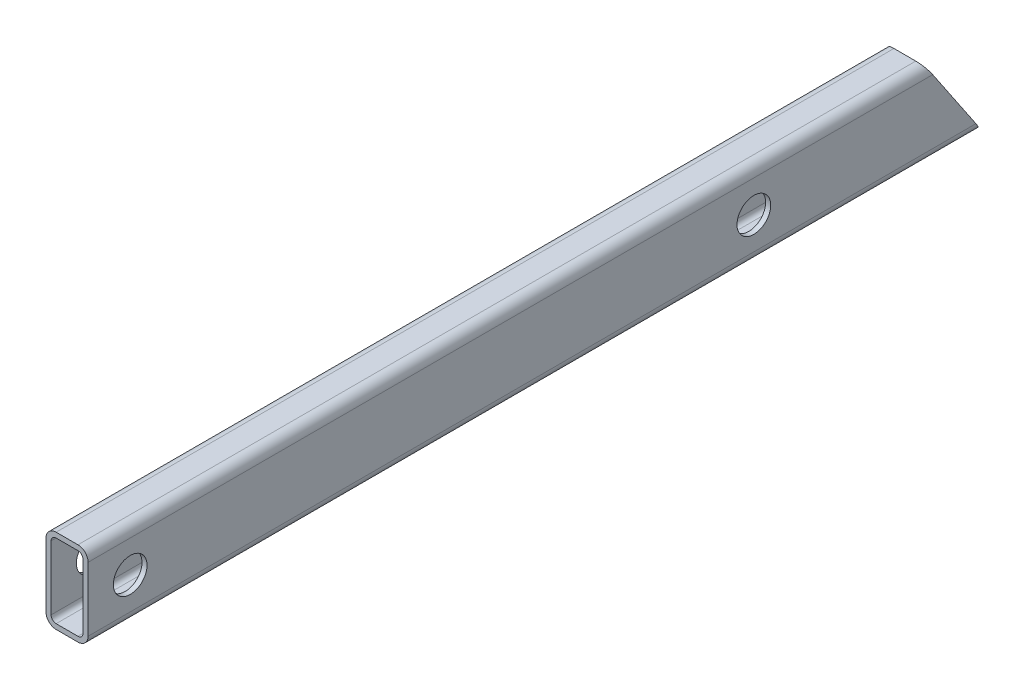
ISO-10303-21;
HEADER;
FILE_DESCRIPTION(('STEP AP214'),'2;1');
FILE_NAME('part.step','',(''),(''),'','','');
FILE_SCHEMA(('AUTOMOTIVE_DESIGN { 1 0 10303 214 1 1 1 1 }'));
ENDSEC;
DATA;
#1=APPLICATION_CONTEXT('core data for automotive mechanical design processes');
#2=APPLICATION_PROTOCOL_DEFINITION('international standard','automotive_design',2000,#1);
#3=PRODUCT_CONTEXT('',#1,'mechanical');
#4=PRODUCT('Part','Part','',(#3));
#5=PRODUCT_RELATED_PRODUCT_CATEGORY('part','',(#4));
#6=PRODUCT_DEFINITION_FORMATION('','',#4);
#7=PRODUCT_DEFINITION_CONTEXT('part definition',#1,'design');
#8=PRODUCT_DEFINITION('design','',#6,#7);
#9=PRODUCT_DEFINITION_SHAPE('','',#8);
#10=(LENGTH_UNIT() NAMED_UNIT(*) SI_UNIT(.MILLI.,.METRE.));
#11=(NAMED_UNIT(*) PLANE_ANGLE_UNIT() SI_UNIT($,.RADIAN.));
#12=(NAMED_UNIT(*) SI_UNIT($,.STERADIAN.) SOLID_ANGLE_UNIT());
#13=UNCERTAINTY_MEASURE_WITH_UNIT(LENGTH_MEASURE(1.E-05),#10,'distance_accuracy_value','');
#14=(GEOMETRIC_REPRESENTATION_CONTEXT(3) GLOBAL_UNCERTAINTY_ASSIGNED_CONTEXT((#13)) GLOBAL_UNIT_ASSIGNED_CONTEXT((#10,
#11,#12)) REPRESENTATION_CONTEXT('',''));
#15=CARTESIAN_POINT('',(0.,0.,0.));
#16=DIRECTION('',(0.,0.,1.));
#17=DIRECTION('',(1.,0.,0.));
#18=AXIS2_PLACEMENT_3D('',#15,#16,#17);
#19=CARTESIAN_POINT('',(6.,6.,530.8));
#20=DIRECTION('',(0.,0.,-1.));
#21=DIRECTION('',(-1.,0.,0.));
#22=AXIS2_PLACEMENT_3D('',#19,#20,#21);
#23=PLANE('',#22);
#24=CARTESIAN_POINT('',(6.,6.,530.8));
#25=DIRECTION('',(0.,0.,1.));
#26=DIRECTION('',(-1.,0.,0.));
#27=AXIS2_PLACEMENT_3D('',#24,#25,#26);
#28=CIRCLE('',#27,6.);
#29=CARTESIAN_POINT('',(0.,6.,530.8));
#30=VERTEX_POINT('',#29);
#31=CARTESIAN_POINT('',(6.,0.,530.8));
#32=VERTEX_POINT('',#31);
#33=EDGE_CURVE('E244',#30,#32,#28,.T.);
#34=ORIENTED_EDGE('',*,*,#33,.T.);
#35=DIRECTION('',(1.,0.,0.));
#36=VECTOR('',#35,1.);
#37=CARTESIAN_POINT('',(6.,0.,530.8));
#38=LINE('',#37,#36);
#39=CARTESIAN_POINT('',(18.9611964303452,0.,530.8));
#40=VERTEX_POINT('',#39);
#41=EDGE_CURVE('E247',#32,#40,#38,.T.);
#42=ORIENTED_EDGE('',*,*,#41,.T.);
#43=CARTESIAN_POINT('',(18.9611964303452,6.,530.8));
#44=DIRECTION('',(0.,0.,1.));
#45=DIRECTION('',(1.,0.,0.));
#46=AXIS2_PLACEMENT_3D('',#43,#44,#45);
#47=CIRCLE('',#46,6.);
#48=CARTESIAN_POINT('',(24.9611964303452,6.,530.8));
#49=VERTEX_POINT('',#48);
#50=EDGE_CURVE('E249',#40,#49,#47,.T.);
#51=ORIENTED_EDGE('',*,*,#50,.T.);
#52=DIRECTION('',(0.,1.,0.));
#53=VECTOR('',#52,1.);
#54=CARTESIAN_POINT('',(24.9611964303453,44.,530.8));
#55=LINE('',#54,#53);
#56=CARTESIAN_POINT('',(24.9611964303453,44.,530.8));
#57=VERTEX_POINT('',#56);
#58=EDGE_CURVE('E251',#49,#57,#55,.T.);
#59=ORIENTED_EDGE('',*,*,#58,.T.);
#60=CARTESIAN_POINT('',(18.9611964303452,44.,530.8));
#61=DIRECTION('',(0.,0.,1.));
#62=DIRECTION('',(-1.,0.,0.));
#63=AXIS2_PLACEMENT_3D('',#60,#61,#62);
#64=CIRCLE('',#63,6.00000000000001);
#65=CARTESIAN_POINT('',(18.9611964303452,50.,530.8));
#66=VERTEX_POINT('',#65);
#67=EDGE_CURVE('E177',#57,#66,#64,.T.);
#68=ORIENTED_EDGE('',*,*,#67,.T.);
#69=DIRECTION('',(-1.,0.,0.));
#70=VECTOR('',#69,1.);
#71=CARTESIAN_POINT('',(6.,50.,530.8));
#72=LINE('',#71,#70);
#73=CARTESIAN_POINT('',(6.,50.,530.8));
#74=VERTEX_POINT('',#73);
#75=EDGE_CURVE('E254',#66,#74,#72,.T.);
#76=ORIENTED_EDGE('',*,*,#75,.T.);
#77=CARTESIAN_POINT('',(6.,44.,530.8));
#78=DIRECTION('',(0.,0.,1.));
#79=DIRECTION('',(1.,0.,0.));
#80=AXIS2_PLACEMENT_3D('',#77,#78,#79);
#81=CIRCLE('',#80,6.);
#82=CARTESIAN_POINT('',(0.,44.,530.8));
#83=VERTEX_POINT('',#82);
#84=EDGE_CURVE('E256',#74,#83,#81,.T.);
#85=ORIENTED_EDGE('',*,*,#84,.T.);
#86=DIRECTION('',(0.,-1.,0.));
#87=VECTOR('',#86,1.);
#88=CARTESIAN_POINT('',(0.,44.,530.8));
#89=LINE('',#88,#87);
#90=EDGE_CURVE('E258',#83,#30,#89,.T.);
#91=ORIENTED_EDGE('',*,*,#90,.T.);
#92=EDGE_LOOP('',(#34,#42,#51,#59,#68,#76,#85,#91));
#93=FACE_BOUND('',#92,.T.);
#94=CARTESIAN_POINT('',(6.,6.,530.8));
#95=DIRECTION('',(0.,0.,1.));
#96=DIRECTION('',(-1.,0.,0.));
#97=AXIS2_PLACEMENT_3D('',#94,#95,#96);
#98=CIRCLE('',#97,3.);
#99=CARTESIAN_POINT('',(3.,6.,530.8));
#100=VERTEX_POINT('',#99);
#101=CARTESIAN_POINT('',(6.,3.,530.8));
#102=VERTEX_POINT('',#101);
#103=EDGE_CURVE('E195',#100,#102,#98,.T.);
#104=ORIENTED_EDGE('',*,*,#103,.F.);
#105=DIRECTION('',(0.,-1.,0.));
#106=VECTOR('',#105,1.);
#107=CARTESIAN_POINT('',(3.,44.,530.8));
#108=LINE('',#107,#106);
#109=CARTESIAN_POINT('',(3.,44.,530.8));
#110=VERTEX_POINT('',#109);
#111=EDGE_CURVE('E217',#110,#100,#108,.T.);
#112=ORIENTED_EDGE('',*,*,#111,.F.);
#113=CARTESIAN_POINT('',(6.,44.,530.8));
#114=DIRECTION('',(0.,0.,1.));
#115=DIRECTION('',(1.,0.,0.));
#116=AXIS2_PLACEMENT_3D('',#113,#114,#115);
#117=CIRCLE('',#116,3.);
#118=CARTESIAN_POINT('',(6.,47.,530.8));
#119=VERTEX_POINT('',#118);
#120=EDGE_CURVE('E214',#119,#110,#117,.T.);
#121=ORIENTED_EDGE('',*,*,#120,.F.);
#122=DIRECTION('',(-1.,0.,0.));
#123=VECTOR('',#122,1.);
#124=CARTESIAN_POINT('',(6.,47.,530.8));
#125=LINE('',#124,#123);
#126=CARTESIAN_POINT('',(18.9611964303452,47.,530.8));
#127=VERTEX_POINT('',#126);
#128=EDGE_CURVE('E212',#127,#119,#125,.T.);
#129=ORIENTED_EDGE('',*,*,#128,.F.);
#130=CARTESIAN_POINT('',(18.9611964303452,44.,530.8));
#131=DIRECTION('',(0.,0.,1.));
#132=DIRECTION('',(-1.,0.,0.));
#133=AXIS2_PLACEMENT_3D('',#130,#131,#132);
#134=CIRCLE('',#133,3.);
#135=CARTESIAN_POINT('',(21.9611964303452,44.,530.8));
#136=VERTEX_POINT('',#135);
#137=EDGE_CURVE('E210',#136,#127,#134,.T.);
#138=ORIENTED_EDGE('',*,*,#137,.F.);
#139=DIRECTION('',(0.,1.,0.));
#140=VECTOR('',#139,1.);
#141=CARTESIAN_POINT('',(21.9611964303452,44.,530.8));
#142=LINE('',#141,#140);
#143=CARTESIAN_POINT('',(21.9611964303452,6.,530.8));
#144=VERTEX_POINT('',#143);
#145=EDGE_CURVE('E208',#144,#136,#142,.T.);
#146=ORIENTED_EDGE('',*,*,#145,.F.);
#147=CARTESIAN_POINT('',(18.9611964303452,6.,530.8));
#148=DIRECTION('',(0.,0.,1.));
#149=DIRECTION('',(1.,0.,0.));
#150=AXIS2_PLACEMENT_3D('',#147,#148,#149);
#151=CIRCLE('',#150,3.);
#152=CARTESIAN_POINT('',(18.9611964303452,3.,530.8));
#153=VERTEX_POINT('',#152);
#154=EDGE_CURVE('E206',#153,#144,#151,.T.);
#155=ORIENTED_EDGE('',*,*,#154,.F.);
#156=DIRECTION('',(1.,0.,0.));
#157=VECTOR('',#156,1.);
#158=CARTESIAN_POINT('',(6.,3.,530.8));
#159=LINE('',#158,#157);
#160=EDGE_CURVE('E204',#102,#153,#159,.T.);
#161=ORIENTED_EDGE('',*,*,#160,.F.);
#162=EDGE_LOOP('',(#104,#112,#121,#129,#138,#146,#155,#161));
#163=FACE_BOUND('',#162,.T.);
#164=ADVANCED_FACE('F38',(#93,#163),#23,.F.);
#165=CARTESIAN_POINT('',(6.,6.,530.8));
#166=DIRECTION('',(0.,0.,-1.));
#167=DIRECTION('',(-1.,0.,0.));
#168=AXIS2_PLACEMENT_3D('',#165,#166,#167);
#169=CYLINDRICAL_SURFACE('',#168,6.);
#170=DIRECTION('',(0.,0.,-1.));
#171=VECTOR('',#170,1.);
#172=CARTESIAN_POINT('',(0.,6.,530.8));
#173=LINE('',#172,#171);
#174=CARTESIAN_POINT('',(0.,6.,4.04760000000005));
#175=VERTEX_POINT('',#174);
#176=EDGE_CURVE('E260',#30,#175,#173,.T.);
#177=ORIENTED_EDGE('',*,*,#176,.T.);
#178=CARTESIAN_POINT('',(6.,6.,4.04759999999993));
#179=DIRECTION('',(0.,-0.559245027281367,0.829002412216673));
#180=DIRECTION('',(0.,-0.829002412216674,-0.559245027281367));
#181=AXIS2_PLACEMENT_3D('',#178,#179,#180);
#182=ELLIPSE('',#181,7.2376146457241,6.);
#183=CARTESIAN_POINT('',(6.,0.,0.));
#184=VERTEX_POINT('',#183);
#185=EDGE_CURVE('E55',#175,#184,#182,.T.);
#186=ORIENTED_EDGE('',*,*,#185,.T.);
#187=DIRECTION('',(0.,0.,-1.));
#188=VECTOR('',#187,1.);
#189=CARTESIAN_POINT('',(6.,0.,530.8));
#190=LINE('',#189,#188);
#191=EDGE_CURVE('E47',#32,#184,#190,.T.);
#192=ORIENTED_EDGE('',*,*,#191,.F.);
#193=ORIENTED_EDGE('',*,*,#33,.F.);
#194=EDGE_LOOP('',(#177,#186,#192,#193));
#195=FACE_BOUND('',#194,.T.);
#196=ADVANCED_FACE('F40',(#195),#169,.T.);
#197=CARTESIAN_POINT('',(6.,0.,530.8));
#198=DIRECTION('',(0.,1.,0.));
#199=DIRECTION('',(0.,0.,1.));
#200=AXIS2_PLACEMENT_3D('',#197,#198,#199);
#201=PLANE('',#200);
#202=DIRECTION('',(1.,0.,0.));
#203=VECTOR('',#202,1.);
#204=CARTESIAN_POINT('',(6.,0.,0.));
#205=LINE('',#204,#203);
#206=CARTESIAN_POINT('',(18.9611964303452,0.,0.));
#207=VERTEX_POINT('',#206);
#208=EDGE_CURVE('E243',#184,#207,#205,.T.);
#209=ORIENTED_EDGE('',*,*,#208,.T.);
#210=DIRECTION('',(0.,0.,-1.));
#211=VECTOR('',#210,1.);
#212=CARTESIAN_POINT('',(18.9611964303452,0.,530.8));
#213=LINE('',#212,#211);
#214=EDGE_CURVE('E180',#40,#207,#213,.T.);
#215=ORIENTED_EDGE('',*,*,#214,.F.);
#216=ORIENTED_EDGE('',*,*,#41,.F.);
#217=ORIENTED_EDGE('',*,*,#191,.T.);
#218=EDGE_LOOP('',(#209,#215,#216,#217));
#219=FACE_BOUND('',#218,.T.);
#220=ADVANCED_FACE('F352',(#219),#201,.F.);
#221=CARTESIAN_POINT('',(18.9611964303452,6.,530.8));
#222=DIRECTION('',(0.,0.,-1.));
#223=DIRECTION('',(-1.,0.,0.));
#224=AXIS2_PLACEMENT_3D('',#221,#222,#223);
#225=CYLINDRICAL_SURFACE('',#224,6.);
#226=ORIENTED_EDGE('',*,*,#214,.T.);
#227=CARTESIAN_POINT('',(18.9611964303452,6.,4.04759999999993));
#228=DIRECTION('',(0.,-0.559245027281367,0.829002412216673));
#229=DIRECTION('',(0.,-0.829002412216674,-0.559245027281367));
#230=AXIS2_PLACEMENT_3D('',#227,#228,#229);
#231=ELLIPSE('',#230,7.2376146457241,6.);
#232=CARTESIAN_POINT('',(24.9611964303452,5.99999999999999,4.04759999999998));
#233=VERTEX_POINT('',#232);
#234=EDGE_CURVE('E161',#207,#233,#231,.T.);
#235=ORIENTED_EDGE('',*,*,#234,.T.);
#236=DIRECTION('',(0.,0.,-1.));
#237=VECTOR('',#236,1.);
#238=CARTESIAN_POINT('',(24.9611964303452,6.,530.8));
#239=LINE('',#238,#237);
#240=EDGE_CURVE('E172',#49,#233,#239,.T.);
#241=ORIENTED_EDGE('',*,*,#240,.F.);
#242=ORIENTED_EDGE('',*,*,#50,.F.);
#243=EDGE_LOOP('',(#226,#235,#241,#242));
#244=FACE_BOUND('',#243,.T.);
#245=ADVANCED_FACE('F368',(#244),#225,.T.);
#246=CARTESIAN_POINT('',(24.9611964303453,44.,530.8));
#247=DIRECTION('',(-1.,0.,0.));
#248=DIRECTION('',(0.,-1.,0.));
#249=AXIS2_PLACEMENT_3D('',#246,#247,#248);
#250=PLANE('',#249);
#251=CARTESIAN_POINT('',(24.9611964303452,25.,135.8));
#252=DIRECTION('',(1.,0.,0.));
#253=DIRECTION('',(0.,1.,0.));
#254=AXIS2_PLACEMENT_3D('',#251,#252,#253);
#255=CIRCLE('',#254,9.99999999999998);
#256=CARTESIAN_POINT('',(24.9611964303453,35.,135.8));
#257=VERTEX_POINT('',#256);
#258=EDGE_CURVE('E550',#257,#257,#255,.T.);
#259=ORIENTED_EDGE('',*,*,#258,.F.);
#260=EDGE_LOOP('',(#259));
#261=FACE_BOUND('',#260,.T.);
#262=CARTESIAN_POINT('',(24.9611964303452,25.,505.8));
#263=DIRECTION('',(1.,0.,0.));
#264=DIRECTION('',(0.,1.,0.));
#265=AXIS2_PLACEMENT_3D('',#262,#263,#264);
#266=CIRCLE('',#265,9.99999999999998);
#267=CARTESIAN_POINT('',(24.9611964303453,35.,505.8));
#268=VERTEX_POINT('',#267);
#269=EDGE_CURVE('E276',#268,#268,#266,.T.);
#270=ORIENTED_EDGE('',*,*,#269,.F.);
#271=EDGE_LOOP('',(#270));
#272=FACE_BOUND('',#271,.T.);
#273=ORIENTED_EDGE('',*,*,#240,.T.);
#274=DIRECTION('',(0.,-0.829002412216673,-0.559245027281367));
#275=VECTOR('',#274,1.);
#276=CARTESIAN_POINT('',(24.9611964303452,0.,0.));
#277=LINE('',#276,#275);
#278=CARTESIAN_POINT('',(24.9611964303453,44.,29.6823999999999));
#279=VERTEX_POINT('',#278);
#280=EDGE_CURVE('E153',#279,#233,#277,.T.);
#281=ORIENTED_EDGE('',*,*,#280,.F.);
#282=DIRECTION('',(0.,0.,-1.));
#283=VECTOR('',#282,1.);
#284=CARTESIAN_POINT('',(24.9611964303453,44.,530.8));
#285=LINE('',#284,#283);
#286=EDGE_CURVE('E169',#57,#279,#285,.T.);
#287=ORIENTED_EDGE('',*,*,#286,.F.);
#288=ORIENTED_EDGE('',*,*,#58,.F.);
#289=EDGE_LOOP('',(#273,#281,#287,#288));
#290=FACE_BOUND('',#289,.T.);
#291=ADVANCED_FACE('F167',(#261,#272,#290),#250,.F.);
#292=CARTESIAN_POINT('',(18.9611964303452,44.,530.8));
#293=DIRECTION('',(0.,0.,-1.));
#294=DIRECTION('',(-1.,0.,0.));
#295=AXIS2_PLACEMENT_3D('',#292,#293,#294);
#296=CYLINDRICAL_SURFACE('',#295,6.00000000000001);
#297=ORIENTED_EDGE('',*,*,#286,.T.);
#298=CARTESIAN_POINT('',(18.9611964303452,44.,29.6823999999999));
#299=DIRECTION('',(0.,-0.559245027281367,0.829002412216673));
#300=DIRECTION('',(0.,-0.829002412216674,-0.559245027281367));
#301=AXIS2_PLACEMENT_3D('',#298,#299,#300);
#302=ELLIPSE('',#301,7.2376146457241,6.00000000000001);
#303=CARTESIAN_POINT('',(18.9611964303452,50.,33.7299999999999));
#304=VERTEX_POINT('',#303);
#305=EDGE_CURVE('E150',#279,#304,#302,.T.);
#306=ORIENTED_EDGE('',*,*,#305,.T.);
#307=DIRECTION('',(0.,0.,-1.));
#308=VECTOR('',#307,1.);
#309=CARTESIAN_POINT('',(18.9611964303452,50.,530.8));
#310=LINE('',#309,#308);
#311=EDGE_CURVE('E178',#66,#304,#310,.T.);
#312=ORIENTED_EDGE('',*,*,#311,.F.);
#313=ORIENTED_EDGE('',*,*,#67,.F.);
#314=EDGE_LOOP('',(#297,#306,#312,#313));
#315=FACE_BOUND('',#314,.T.);
#316=ADVANCED_FACE('F176',(#315),#296,.T.);
#317=CARTESIAN_POINT('',(6.,50.,530.8));
#318=DIRECTION('',(0.,-1.,0.));
#319=DIRECTION('',(0.,0.,-1.));
#320=AXIS2_PLACEMENT_3D('',#317,#318,#319);
#321=PLANE('',#320);
#322=ORIENTED_EDGE('',*,*,#311,.T.);
#323=DIRECTION('',(1.,0.,0.));
#324=VECTOR('',#323,1.);
#325=CARTESIAN_POINT('',(0.,50.,33.7299999999999));
#326=LINE('',#325,#324);
#327=CARTESIAN_POINT('',(6.,50.,33.7299999999999));
#328=VERTEX_POINT('',#327);
#329=EDGE_CURVE('E156',#328,#304,#326,.T.);
#330=ORIENTED_EDGE('',*,*,#329,.F.);
#331=DIRECTION('',(0.,0.,-1.));
#332=VECTOR('',#331,1.);
#333=CARTESIAN_POINT('',(6.,50.,530.8));
#334=LINE('',#333,#332);
#335=EDGE_CURVE('E182',#74,#328,#334,.T.);
#336=ORIENTED_EDGE('',*,*,#335,.F.);
#337=ORIENTED_EDGE('',*,*,#75,.F.);
#338=EDGE_LOOP('',(#322,#330,#336,#337));
#339=FACE_BOUND('',#338,.T.);
#340=ADVANCED_FACE('F275',(#339),#321,.F.);
#341=CARTESIAN_POINT('',(6.,44.,530.8));
#342=DIRECTION('',(0.,0.,-1.));
#343=DIRECTION('',(-1.,0.,0.));
#344=AXIS2_PLACEMENT_3D('',#341,#342,#343);
#345=CYLINDRICAL_SURFACE('',#344,6.);
#346=ORIENTED_EDGE('',*,*,#335,.T.);
#347=CARTESIAN_POINT('',(6.,44.,29.6823999999999));
#348=DIRECTION('',(0.,-0.559245027281367,0.829002412216673));
#349=DIRECTION('',(0.,-0.829002412216674,-0.559245027281367));
#350=AXIS2_PLACEMENT_3D('',#347,#348,#349);
#351=ELLIPSE('',#350,7.2376146457241,6.);
#352=CARTESIAN_POINT('',(0.,44.,29.6823999999999));
#353=VERTEX_POINT('',#352);
#354=EDGE_CURVE('E162',#328,#353,#351,.T.);
#355=ORIENTED_EDGE('',*,*,#354,.T.);
#356=DIRECTION('',(0.,0.,-1.));
#357=VECTOR('',#356,1.);
#358=CARTESIAN_POINT('',(0.,44.,530.8));
#359=LINE('',#358,#357);
#360=EDGE_CURVE('E264',#83,#353,#359,.T.);
#361=ORIENTED_EDGE('',*,*,#360,.F.);
#362=ORIENTED_EDGE('',*,*,#84,.F.);
#363=EDGE_LOOP('',(#346,#355,#361,#362));
#364=FACE_BOUND('',#363,.T.);
#365=ADVANCED_FACE('F271',(#364),#345,.T.);
#366=CARTESIAN_POINT('',(0.,44.,530.8));
#367=DIRECTION('',(1.,0.,0.));
#368=DIRECTION('',(0.,0.,-1.));
#369=AXIS2_PLACEMENT_3D('',#366,#367,#368);
#370=PLANE('',#369);
#371=CARTESIAN_POINT('',(0.,25.,135.8));
#372=DIRECTION('',(1.,0.,0.));
#373=DIRECTION('',(0.,1.,0.));
#374=AXIS2_PLACEMENT_3D('',#371,#372,#373);
#375=CIRCLE('',#374,9.99999999999998);
#376=CARTESIAN_POINT('',(0.,35.,135.8));
#377=VERTEX_POINT('',#376);
#378=EDGE_CURVE('E551',#377,#377,#375,.T.);
#379=ORIENTED_EDGE('',*,*,#378,.T.);
#380=EDGE_LOOP('',(#379));
#381=FACE_BOUND('',#380,.T.);
#382=CARTESIAN_POINT('',(0.,25.,505.8));
#383=DIRECTION('',(1.,0.,0.));
#384=DIRECTION('',(0.,1.,0.));
#385=AXIS2_PLACEMENT_3D('',#382,#383,#384);
#386=CIRCLE('',#385,9.99999999999998);
#387=CARTESIAN_POINT('',(0.,35.,505.8));
#388=VERTEX_POINT('',#387);
#389=EDGE_CURVE('E279',#388,#388,#386,.T.);
#390=ORIENTED_EDGE('',*,*,#389,.T.);
#391=EDGE_LOOP('',(#390));
#392=FACE_BOUND('',#391,.T.);
#393=ORIENTED_EDGE('',*,*,#360,.T.);
#394=DIRECTION('',(0.,-0.829002412216673,-0.559245027281367));
#395=VECTOR('',#394,1.);
#396=CARTESIAN_POINT('',(0.,0.,0.));
#397=LINE('',#396,#395);
#398=EDGE_CURVE('E173',#353,#175,#397,.T.);
#399=ORIENTED_EDGE('',*,*,#398,.T.);
#400=ORIENTED_EDGE('',*,*,#176,.F.);
#401=ORIENTED_EDGE('',*,*,#90,.F.);
#402=EDGE_LOOP('',(#393,#399,#400,#401));
#403=FACE_BOUND('',#402,.T.);
#404=ADVANCED_FACE('F356',(#381,#392,#403),#370,.F.);
#405=CARTESIAN_POINT('',(6.,6.,530.8));
#406=DIRECTION('',(0.,0.,-1.));
#407=DIRECTION('',(-1.,0.,0.));
#408=AXIS2_PLACEMENT_3D('',#405,#406,#407);
#409=CYLINDRICAL_SURFACE('',#408,3.);
#410=CARTESIAN_POINT('',(6.,6.,4.04759999999993));
#411=DIRECTION('',(0.,-0.559245027281367,0.829002412216673));
#412=DIRECTION('',(0.,-0.829002412216674,-0.559245027281367));
#413=AXIS2_PLACEMENT_3D('',#410,#411,#412);
#414=ELLIPSE('',#413,3.61880732286205,3.);
#415=CARTESIAN_POINT('',(3.,6.00000000000001,4.04759999999996));
#416=VERTEX_POINT('',#415);
#417=CARTESIAN_POINT('',(6.,3.,2.02380000000002));
#418=VERTEX_POINT('',#417);
#419=EDGE_CURVE('E294',#416,#418,#414,.T.);
#420=ORIENTED_EDGE('',*,*,#419,.F.);
#421=DIRECTION('',(0.,0.,-1.));
#422=VECTOR('',#421,1.);
#423=CARTESIAN_POINT('',(3.,6.,530.8));
#424=LINE('',#423,#422);
#425=EDGE_CURVE('E219',#100,#416,#424,.T.);
#426=ORIENTED_EDGE('',*,*,#425,.F.);
#427=ORIENTED_EDGE('',*,*,#103,.T.);
#428=DIRECTION('',(0.,0.,-1.));
#429=VECTOR('',#428,1.);
#430=CARTESIAN_POINT('',(6.,3.,530.8));
#431=LINE('',#430,#429);
#432=EDGE_CURVE('E240',#102,#418,#431,.T.);
#433=ORIENTED_EDGE('',*,*,#432,.T.);
#434=EDGE_LOOP('',(#420,#426,#427,#433));
#435=FACE_BOUND('',#434,.T.);
#436=ADVANCED_FACE('F306',(#435),#409,.F.);
#437=CARTESIAN_POINT('',(6.,3.,530.8));
#438=DIRECTION('',(0.,1.,0.));
#439=DIRECTION('',(0.,0.,1.));
#440=AXIS2_PLACEMENT_3D('',#437,#438,#439);
#441=PLANE('',#440);
#442=DIRECTION('',(1.,0.,0.));
#443=VECTOR('',#442,1.);
#444=CARTESIAN_POINT('',(6.00000000000006,3.,2.02380000000002));
#445=LINE('',#444,#443);
#446=CARTESIAN_POINT('',(18.9611964303452,3.,2.02379999999991));
#447=VERTEX_POINT('',#446);
#448=EDGE_CURVE('E292',#418,#447,#445,.T.);
#449=ORIENTED_EDGE('',*,*,#448,.F.);
#450=ORIENTED_EDGE('',*,*,#432,.F.);
#451=ORIENTED_EDGE('',*,*,#160,.T.);
#452=DIRECTION('',(0.,0.,-1.));
#453=VECTOR('',#452,1.);
#454=CARTESIAN_POINT('',(18.9611964303452,3.,530.8));
#455=LINE('',#454,#453);
#456=EDGE_CURVE('E237',#153,#447,#455,.T.);
#457=ORIENTED_EDGE('',*,*,#456,.T.);
#458=EDGE_LOOP('',(#449,#450,#451,#457));
#459=FACE_BOUND('',#458,.T.);
#460=ADVANCED_FACE('F303',(#459),#441,.T.);
#461=CARTESIAN_POINT('',(18.9611964303452,6.,530.8));
#462=DIRECTION('',(0.,0.,-1.));
#463=DIRECTION('',(-1.,0.,0.));
#464=AXIS2_PLACEMENT_3D('',#461,#462,#463);
#465=CYLINDRICAL_SURFACE('',#464,3.);
#466=CARTESIAN_POINT('',(18.9611964303452,6.,4.04759999999993));
#467=DIRECTION('',(0.,-0.559245027281367,0.829002412216673));
#468=DIRECTION('',(0.,-0.829002412216674,-0.559245027281367));
#469=AXIS2_PLACEMENT_3D('',#466,#467,#468);
#470=ELLIPSE('',#469,3.61880732286205,3.);
#471=CARTESIAN_POINT('',(21.9611964303452,6.00000000000001,4.04759999999996));
#472=VERTEX_POINT('',#471);
#473=EDGE_CURVE('E290',#447,#472,#470,.T.);
#474=ORIENTED_EDGE('',*,*,#473,.F.);
#475=ORIENTED_EDGE('',*,*,#456,.F.);
#476=ORIENTED_EDGE('',*,*,#154,.T.);
#477=DIRECTION('',(0.,0.,-1.));
#478=VECTOR('',#477,1.);
#479=CARTESIAN_POINT('',(21.9611964303452,6.,530.8));
#480=LINE('',#479,#478);
#481=EDGE_CURVE('E234',#144,#472,#480,.T.);
#482=ORIENTED_EDGE('',*,*,#481,.T.);
#483=EDGE_LOOP('',(#474,#475,#476,#482));
#484=FACE_BOUND('',#483,.T.);
#485=ADVANCED_FACE('F314',(#484),#465,.F.);
#486=CARTESIAN_POINT('',(21.9611964303452,44.,530.8));
#487=DIRECTION('',(-1.,0.,0.));
#488=DIRECTION('',(0.,0.,1.));
#489=AXIS2_PLACEMENT_3D('',#486,#487,#488);
#490=PLANE('',#489);
#491=CARTESIAN_POINT('',(21.9611964303452,25.,135.8));
#492=DIRECTION('',(-1.,0.,0.));
#493=DIRECTION('',(0.,0.,1.));
#494=AXIS2_PLACEMENT_3D('',#491,#492,#493);
#495=CIRCLE('',#494,9.99999999999998);
#496=CARTESIAN_POINT('',(21.9611964303452,25.,145.8));
#497=VERTEX_POINT('',#496);
#498=EDGE_CURVE('E174',#497,#497,#495,.T.);
#499=ORIENTED_EDGE('',*,*,#498,.F.);
#500=EDGE_LOOP('',(#499));
#501=FACE_BOUND('',#500,.T.);
#502=CARTESIAN_POINT('',(21.9611964303452,25.,505.8));
#503=DIRECTION('',(-1.,0.,0.));
#504=DIRECTION('',(0.,0.,1.));
#505=AXIS2_PLACEMENT_3D('',#502,#503,#504);
#506=CIRCLE('',#505,9.99999999999998);
#507=CARTESIAN_POINT('',(21.9611964303452,25.,515.8));
#508=VERTEX_POINT('',#507);
#509=EDGE_CURVE('E191',#508,#508,#506,.T.);
#510=ORIENTED_EDGE('',*,*,#509,.F.);
#511=EDGE_LOOP('',(#510));
#512=FACE_BOUND('',#511,.T.);
#513=DIRECTION('',(0.,0.829002412216674,0.559245027281367));
#514=VECTOR('',#513,1.);
#515=CARTESIAN_POINT('',(21.9611964303452,276.325874974905,186.409435258071));
#516=LINE('',#515,#514);
#517=CARTESIAN_POINT('',(21.9611964303452,44.,29.6823999999999));
#518=VERTEX_POINT('',#517);
#519=EDGE_CURVE('E288',#472,#518,#516,.T.);
#520=ORIENTED_EDGE('',*,*,#519,.F.);
#521=ORIENTED_EDGE('',*,*,#481,.F.);
#522=ORIENTED_EDGE('',*,*,#145,.T.);
#523=DIRECTION('',(0.,0.,-1.));
#524=VECTOR('',#523,1.);
#525=CARTESIAN_POINT('',(21.9611964303452,44.,530.8));
#526=LINE('',#525,#524);
#527=EDGE_CURVE('E231',#136,#518,#526,.T.);
#528=ORIENTED_EDGE('',*,*,#527,.T.);
#529=EDGE_LOOP('',(#520,#521,#522,#528));
#530=FACE_BOUND('',#529,.T.);
#531=ADVANCED_FACE('F319',(#501,#512,#530),#490,.T.);
#532=CARTESIAN_POINT('',(18.9611964303452,44.,530.8));
#533=DIRECTION('',(0.,0.,-1.));
#534=DIRECTION('',(-1.,0.,0.));
#535=AXIS2_PLACEMENT_3D('',#532,#533,#534);
#536=CYLINDRICAL_SURFACE('',#535,3.);
#537=CARTESIAN_POINT('',(18.9611964303452,44.,29.6823999999999));
#538=DIRECTION('',(0.,-0.559245027281367,0.829002412216673));
#539=DIRECTION('',(0.,-0.829002412216674,-0.559245027281367));
#540=AXIS2_PLACEMENT_3D('',#537,#538,#539);
#541=ELLIPSE('',#540,3.61880732286205,3.);
#542=CARTESIAN_POINT('',(18.9611964303452,47.,31.7061999999999));
#543=VERTEX_POINT('',#542);
#544=EDGE_CURVE('E286',#518,#543,#541,.T.);
#545=ORIENTED_EDGE('',*,*,#544,.F.);
#546=ORIENTED_EDGE('',*,*,#527,.F.);
#547=ORIENTED_EDGE('',*,*,#137,.T.);
#548=DIRECTION('',(0.,0.,-1.));
#549=VECTOR('',#548,1.);
#550=CARTESIAN_POINT('',(18.9611964303452,47.,530.8));
#551=LINE('',#550,#549);
#552=EDGE_CURVE('E228',#127,#543,#551,.T.);
#553=ORIENTED_EDGE('',*,*,#552,.T.);
#554=EDGE_LOOP('',(#545,#546,#547,#553));
#555=FACE_BOUND('',#554,.T.);
#556=ADVANCED_FACE('F323',(#555),#536,.F.);
#557=CARTESIAN_POINT('',(6.,47.,530.8));
#558=DIRECTION('',(0.,-1.,0.));
#559=DIRECTION('',(0.,0.,-1.));
#560=AXIS2_PLACEMENT_3D('',#557,#558,#559);
#561=PLANE('',#560);
#562=DIRECTION('',(-1.,0.,0.));
#563=VECTOR('',#562,1.);
#564=CARTESIAN_POINT('',(6.00000000000006,47.,31.7061999999999));
#565=LINE('',#564,#563);
#566=CARTESIAN_POINT('',(6.,47.,31.7061999999999));
#567=VERTEX_POINT('',#566);
#568=EDGE_CURVE('E284',#543,#567,#565,.T.);
#569=ORIENTED_EDGE('',*,*,#568,.F.);
#570=ORIENTED_EDGE('',*,*,#552,.F.);
#571=ORIENTED_EDGE('',*,*,#128,.T.);
#572=DIRECTION('',(0.,0.,-1.));
#573=VECTOR('',#572,1.);
#574=CARTESIAN_POINT('',(6.,47.,530.8));
#575=LINE('',#574,#573);
#576=EDGE_CURVE('E225',#119,#567,#575,.T.);
#577=ORIENTED_EDGE('',*,*,#576,.T.);
#578=EDGE_LOOP('',(#569,#570,#571,#577));
#579=FACE_BOUND('',#578,.T.);
#580=ADVANCED_FACE('F329',(#579),#561,.T.);
#581=CARTESIAN_POINT('',(6.,44.,530.8));
#582=DIRECTION('',(0.,0.,-1.));
#583=DIRECTION('',(-1.,0.,0.));
#584=AXIS2_PLACEMENT_3D('',#581,#582,#583);
#585=CYLINDRICAL_SURFACE('',#584,3.);
#586=CARTESIAN_POINT('',(6.,44.,29.6823999999999));
#587=DIRECTION('',(0.,-0.559245027281367,0.829002412216673));
#588=DIRECTION('',(0.,-0.829002412216674,-0.559245027281367));
#589=AXIS2_PLACEMENT_3D('',#586,#587,#588);
#590=ELLIPSE('',#589,3.61880732286205,3.);
#591=CARTESIAN_POINT('',(3.,44.,29.6824));
#592=VERTEX_POINT('',#591);
#593=EDGE_CURVE('E62',#567,#592,#590,.T.);
#594=ORIENTED_EDGE('',*,*,#593,.F.);
#595=ORIENTED_EDGE('',*,*,#576,.F.);
#596=ORIENTED_EDGE('',*,*,#120,.T.);
#597=DIRECTION('',(0.,0.,-1.));
#598=VECTOR('',#597,1.);
#599=CARTESIAN_POINT('',(3.,44.,530.8));
#600=LINE('',#599,#598);
#601=EDGE_CURVE('E222',#110,#592,#600,.T.);
#602=ORIENTED_EDGE('',*,*,#601,.T.);
#603=EDGE_LOOP('',(#594,#595,#596,#602));
#604=FACE_BOUND('',#603,.T.);
#605=ADVANCED_FACE('F331',(#604),#585,.F.);
#606=CARTESIAN_POINT('',(3.,44.,530.8));
#607=DIRECTION('',(1.,0.,0.));
#608=DIRECTION('',(0.,0.,-1.));
#609=AXIS2_PLACEMENT_3D('',#606,#607,#608);
#610=PLANE('',#609);
#611=CARTESIAN_POINT('',(3.,25.,135.8));
#612=DIRECTION('',(1.,0.,0.));
#613=DIRECTION('',(0.,0.,-1.));
#614=AXIS2_PLACEMENT_3D('',#611,#612,#613);
#615=CIRCLE('',#614,9.99999999999998);
#616=CARTESIAN_POINT('',(3.,25.,125.8));
#617=VERTEX_POINT('',#616);
#618=EDGE_CURVE('E42',#617,#617,#615,.T.);
#619=ORIENTED_EDGE('',*,*,#618,.F.);
#620=EDGE_LOOP('',(#619));
#621=FACE_BOUND('',#620,.T.);
#622=CARTESIAN_POINT('',(3.,25.,505.8));
#623=DIRECTION('',(1.,0.,0.));
#624=DIRECTION('',(0.,0.,-1.));
#625=AXIS2_PLACEMENT_3D('',#622,#623,#624);
#626=CIRCLE('',#625,9.99999999999998);
#627=CARTESIAN_POINT('',(3.,25.,495.8));
#628=VERTEX_POINT('',#627);
#629=EDGE_CURVE('E189',#628,#628,#626,.T.);
#630=ORIENTED_EDGE('',*,*,#629,.F.);
#631=EDGE_LOOP('',(#630));
#632=FACE_BOUND('',#631,.T.);
#633=DIRECTION('',(0.,-0.829002412216674,-0.559245027281367));
#634=VECTOR('',#633,1.);
#635=CARTESIAN_POINT('',(3.,276.325874974905,186.409435258071));
#636=LINE('',#635,#634);
#637=EDGE_CURVE('E11',#592,#416,#636,.T.);
#638=ORIENTED_EDGE('',*,*,#637,.F.);
#639=ORIENTED_EDGE('',*,*,#601,.F.);
#640=ORIENTED_EDGE('',*,*,#111,.T.);
#641=ORIENTED_EDGE('',*,*,#425,.T.);
#642=EDGE_LOOP('',(#638,#639,#640,#641));
#643=FACE_BOUND('',#642,.T.);
#644=ADVANCED_FACE('F333',(#621,#632,#643),#610,.T.);
#645=CARTESIAN_POINT('',(0.,0.,0.));
#646=DIRECTION('',(0.,-0.559245027281367,0.829002412216673));
#647=DIRECTION('',(0.,-0.829002412216674,-0.559245027281367));
#648=AXIS2_PLACEMENT_3D('',#645,#646,#647);
#649=PLANE('',#648);
#650=ORIENTED_EDGE('',*,*,#419,.T.);
#651=ORIENTED_EDGE('',*,*,#448,.T.);
#652=ORIENTED_EDGE('',*,*,#473,.T.);
#653=ORIENTED_EDGE('',*,*,#519,.T.);
#654=ORIENTED_EDGE('',*,*,#544,.T.);
#655=ORIENTED_EDGE('',*,*,#568,.T.);
#656=ORIENTED_EDGE('',*,*,#593,.T.);
#657=ORIENTED_EDGE('',*,*,#637,.T.);
#658=EDGE_LOOP('',(#650,#651,#652,#653,#654,#655,#656,#657));
#659=FACE_BOUND('',#658,.T.);
#660=ORIENTED_EDGE('',*,*,#398,.F.);
#661=ORIENTED_EDGE('',*,*,#354,.F.);
#662=ORIENTED_EDGE('',*,*,#329,.T.);
#663=ORIENTED_EDGE('',*,*,#305,.F.);
#664=ORIENTED_EDGE('',*,*,#280,.T.);
#665=ORIENTED_EDGE('',*,*,#234,.F.);
#666=ORIENTED_EDGE('',*,*,#208,.F.);
#667=ORIENTED_EDGE('',*,*,#185,.F.);
#668=EDGE_LOOP('',(#660,#661,#662,#663,#664,#665,#666,#667));
#669=FACE_BOUND('',#668,.T.);
#670=ADVANCED_FACE('F152',(#659,#669),#649,.F.);
#671=CARTESIAN_POINT('',(0.,25.,505.8));
#672=DIRECTION('',(1.,0.,0.));
#673=DIRECTION('',(0.,1.,0.));
#674=AXIS2_PLACEMENT_3D('',#671,#672,#673);
#675=CYLINDRICAL_SURFACE('',#674,9.99999999999998);
#676=ORIENTED_EDGE('',*,*,#629,.T.);
#677=EDGE_LOOP('',(#676));
#678=FACE_BOUND('',#677,.T.);
#679=ORIENTED_EDGE('',*,*,#389,.F.);
#680=EDGE_LOOP('',(#679));
#681=FACE_BOUND('',#680,.T.);
#682=ADVANCED_FACE('F341',(#678,#681),#675,.F.);
#683=ORIENTED_EDGE('',*,*,#509,.T.);
#684=EDGE_LOOP('',(#683));
#685=FACE_BOUND('',#684,.T.);
#686=ORIENTED_EDGE('',*,*,#269,.T.);
#687=EDGE_LOOP('',(#686));
#688=FACE_BOUND('',#687,.T.);
#689=ADVANCED_FACE('F465',(#685,#688),#675,.F.);
#690=CARTESIAN_POINT('',(0.,25.,135.8));
#691=DIRECTION('',(1.,0.,0.));
#692=DIRECTION('',(0.,1.,0.));
#693=AXIS2_PLACEMENT_3D('',#690,#691,#692);
#694=CYLINDRICAL_SURFACE('',#693,9.99999999999998);
#695=ORIENTED_EDGE('',*,*,#618,.T.);
#696=EDGE_LOOP('',(#695));
#697=FACE_BOUND('',#696,.T.);
#698=ORIENTED_EDGE('',*,*,#378,.F.);
#699=EDGE_LOOP('',(#698));
#700=FACE_BOUND('',#699,.T.);
#701=ADVANCED_FACE('F473',(#697,#700),#694,.F.);
#702=ORIENTED_EDGE('',*,*,#498,.T.);
#703=EDGE_LOOP('',(#702));
#704=FACE_BOUND('',#703,.T.);
#705=ORIENTED_EDGE('',*,*,#258,.T.);
#706=EDGE_LOOP('',(#705));
#707=FACE_BOUND('',#706,.T.);
#708=ADVANCED_FACE('F532',(#704,#707),#694,.F.);
#709=CLOSED_SHELL('',(#164,#196,#220,#245,#291,#316,#340,#365,#404,#436,#460,#485,#531,#556,
#580,#605,#644,#670,#682,#689,#701,#708));
#710=MANIFOLD_SOLID_BREP('B2',#709);
#711=ADVANCED_BREP_SHAPE_REPRESENTATION('',(#18,#710),#14);
#712=SHAPE_DEFINITION_REPRESENTATION(#9,#711);
ENDSEC;
END-ISO-10303-21;
